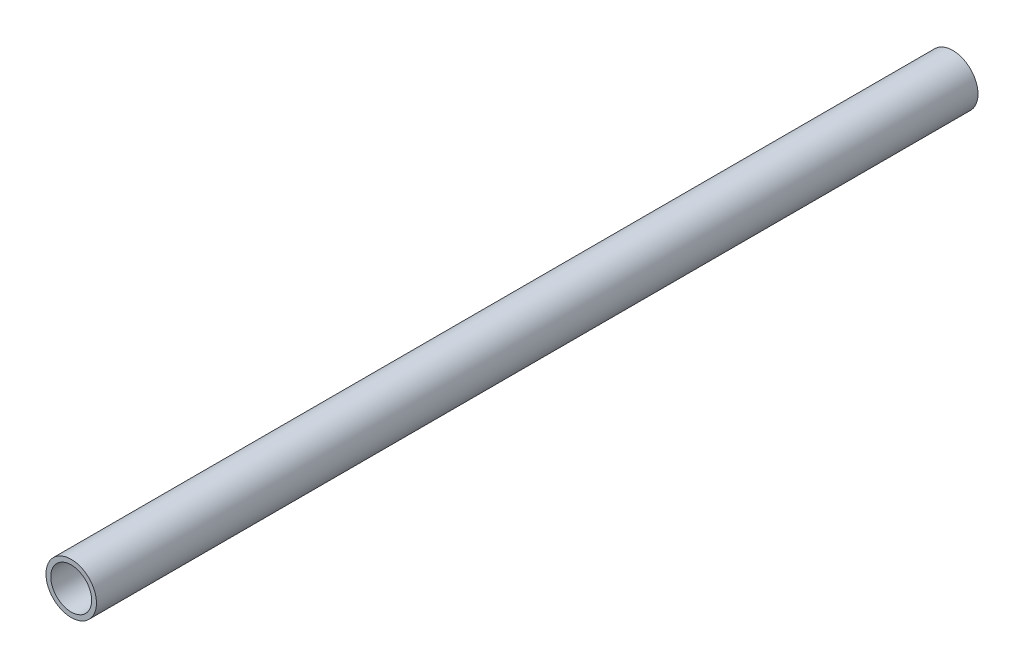
ISO-10303-21;
HEADER;
FILE_DESCRIPTION(('STEP AP214'),'2;1');
FILE_NAME('part.step','',(''),(''),'','','');
FILE_SCHEMA(('AUTOMOTIVE_DESIGN { 1 0 10303 214 1 1 1 1 }'));
ENDSEC;
DATA;
#1=APPLICATION_CONTEXT('core data for automotive mechanical design processes');
#2=APPLICATION_PROTOCOL_DEFINITION('international standard','automotive_design',2000,#1);
#3=PRODUCT_CONTEXT('',#1,'mechanical');
#4=PRODUCT('Part','Part','',(#3));
#5=PRODUCT_RELATED_PRODUCT_CATEGORY('part','',(#4));
#6=PRODUCT_DEFINITION_FORMATION('','',#4);
#7=PRODUCT_DEFINITION_CONTEXT('part definition',#1,'design');
#8=PRODUCT_DEFINITION('design','',#6,#7);
#9=PRODUCT_DEFINITION_SHAPE('','',#8);
#10=(LENGTH_UNIT() NAMED_UNIT(*) SI_UNIT(.MILLI.,.METRE.));
#11=(NAMED_UNIT(*) PLANE_ANGLE_UNIT() SI_UNIT($,.RADIAN.));
#12=(NAMED_UNIT(*) SI_UNIT($,.STERADIAN.) SOLID_ANGLE_UNIT());
#13=UNCERTAINTY_MEASURE_WITH_UNIT(LENGTH_MEASURE(1.E-05),#10,'distance_accuracy_value','');
#14=(GEOMETRIC_REPRESENTATION_CONTEXT(3) GLOBAL_UNCERTAINTY_ASSIGNED_CONTEXT((#13)) GLOBAL_UNIT_ASSIGNED_CONTEXT((#10,
#11,#12)) REPRESENTATION_CONTEXT('',''));
#15=CARTESIAN_POINT('',(0.,0.,0.));
#16=DIRECTION('',(0.,0.,1.));
#17=DIRECTION('',(1.,0.,0.));
#18=AXIS2_PLACEMENT_3D('',#15,#16,#17);
#19=CARTESIAN_POINT('',(0.,0.,-279.4));
#20=DIRECTION('',(0.,0.,1.));
#21=DIRECTION('',(1.,0.,0.));
#22=AXIS2_PLACEMENT_3D('',#19,#20,#21);
#23=CYLINDRICAL_SURFACE('',#22,8.001);
#24=CARTESIAN_POINT('',(0.,0.,-279.4));
#25=DIRECTION('',(0.,0.,1.));
#26=DIRECTION('',(1.,0.,0.));
#27=AXIS2_PLACEMENT_3D('',#24,#25,#26);
#28=CIRCLE('',#27,8.001);
#29=CARTESIAN_POINT('',(8.001,0.,-279.4));
#30=VERTEX_POINT('',#29);
#31=EDGE_CURVE('E10',#30,#30,#28,.T.);
#32=ORIENTED_EDGE('',*,*,#31,.T.);
#33=EDGE_LOOP('',(#32));
#34=FACE_BOUND('',#33,.T.);
#35=CARTESIAN_POINT('',(0.,0.,0.));
#36=DIRECTION('',(0.,0.,1.));
#37=DIRECTION('',(1.,0.,0.));
#38=AXIS2_PLACEMENT_3D('',#35,#36,#37);
#39=CIRCLE('',#38,8.001);
#40=CARTESIAN_POINT('',(8.001,0.,0.));
#41=VERTEX_POINT('',#40);
#42=EDGE_CURVE('E46',#41,#41,#39,.T.);
#43=ORIENTED_EDGE('',*,*,#42,.F.);
#44=EDGE_LOOP('',(#43));
#45=FACE_BOUND('',#44,.T.);
#46=ADVANCED_FACE('F43',(#34,#45),#23,.T.);
#47=CARTESIAN_POINT('',(0.,0.,-279.4));
#48=DIRECTION('',(0.,0.,1.));
#49=DIRECTION('',(1.,0.,0.));
#50=AXIS2_PLACEMENT_3D('',#47,#48,#49);
#51=PLANE('',#50);
#52=CARTESIAN_POINT('',(0.,0.,-279.4));
#53=DIRECTION('',(0.,0.,1.));
#54=DIRECTION('',(1.,0.,0.));
#55=AXIS2_PLACEMENT_3D('',#52,#53,#54);
#56=CIRCLE('',#55,6.477);
#57=CARTESIAN_POINT('',(6.477,0.,-279.4));
#58=VERTEX_POINT('',#57);
#59=EDGE_CURVE('E55',#58,#58,#56,.T.);
#60=ORIENTED_EDGE('',*,*,#59,.T.);
#61=EDGE_LOOP('',(#60));
#62=FACE_BOUND('',#61,.T.);
#63=ORIENTED_EDGE('',*,*,#31,.F.);
#64=EDGE_LOOP('',(#63));
#65=FACE_BOUND('',#64,.T.);
#66=ADVANCED_FACE('F65',(#62,#65),#51,.F.);
#67=CARTESIAN_POINT('',(0.,0.,0.));
#68=DIRECTION('',(0.,0.,1.));
#69=DIRECTION('',(1.,0.,0.));
#70=AXIS2_PLACEMENT_3D('',#67,#68,#69);
#71=PLANE('',#70);
#72=CARTESIAN_POINT('',(0.,0.,0.));
#73=DIRECTION('',(0.,0.,1.));
#74=DIRECTION('',(1.,0.,0.));
#75=AXIS2_PLACEMENT_3D('',#72,#73,#74);
#76=CIRCLE('',#75,6.477);
#77=CARTESIAN_POINT('',(6.477,0.,0.));
#78=VERTEX_POINT('',#77);
#79=EDGE_CURVE('E57',#78,#78,#76,.T.);
#80=ORIENTED_EDGE('',*,*,#79,.F.);
#81=EDGE_LOOP('',(#80));
#82=FACE_BOUND('',#81,.T.);
#83=ORIENTED_EDGE('',*,*,#42,.T.);
#84=EDGE_LOOP('',(#83));
#85=FACE_BOUND('',#84,.T.);
#86=ADVANCED_FACE('F71',(#82,#85),#71,.T.);
#87=CARTESIAN_POINT('',(0.,0.,-279.4));
#88=DIRECTION('',(0.,0.,1.));
#89=DIRECTION('',(1.,0.,0.));
#90=AXIS2_PLACEMENT_3D('',#87,#88,#89);
#91=CYLINDRICAL_SURFACE('',#90,6.477);
#92=ORIENTED_EDGE('',*,*,#59,.F.);
#93=EDGE_LOOP('',(#92));
#94=FACE_BOUND('',#93,.T.);
#95=ORIENTED_EDGE('',*,*,#79,.T.);
#96=EDGE_LOOP('',(#95));
#97=FACE_BOUND('',#96,.T.);
#98=ADVANCED_FACE('F68',(#94,#97),#91,.F.);
#99=CLOSED_SHELL('',(#46,#66,#86,#98));
#100=MANIFOLD_SOLID_BREP('B2',#99);
#101=ADVANCED_BREP_SHAPE_REPRESENTATION('',(#18,#100),#14);
#102=SHAPE_DEFINITION_REPRESENTATION(#9,#101);
ENDSEC;
END-ISO-10303-21;
